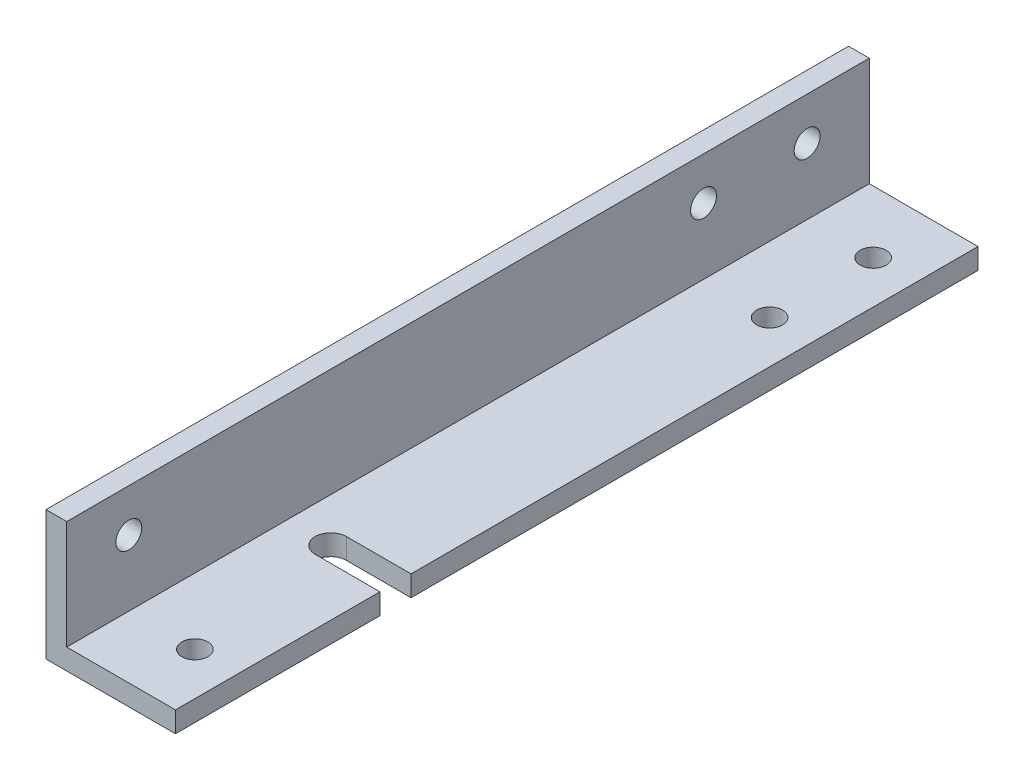
ISO-10303-21;
HEADER;
FILE_DESCRIPTION(('STEP AP214'),'2;1');
FILE_NAME('part.step','',(''),(''),'','','');
FILE_SCHEMA(('AUTOMOTIVE_DESIGN { 1 0 10303 214 1 1 1 1 }'));
ENDSEC;
DATA;
#1=APPLICATION_CONTEXT('core data for automotive mechanical design processes');
#2=APPLICATION_PROTOCOL_DEFINITION('international standard','automotive_design',2000,#1);
#3=PRODUCT_CONTEXT('',#1,'mechanical');
#4=PRODUCT('Part','Part','',(#3));
#5=PRODUCT_RELATED_PRODUCT_CATEGORY('part','',(#4));
#6=PRODUCT_DEFINITION_FORMATION('','',#4);
#7=PRODUCT_DEFINITION_CONTEXT('part definition',#1,'design');
#8=PRODUCT_DEFINITION('design','',#6,#7);
#9=PRODUCT_DEFINITION_SHAPE('','',#8);
#10=(LENGTH_UNIT() NAMED_UNIT(*) SI_UNIT(.MILLI.,.METRE.));
#11=(NAMED_UNIT(*) PLANE_ANGLE_UNIT() SI_UNIT($,.RADIAN.));
#12=(NAMED_UNIT(*) SI_UNIT($,.STERADIAN.) SOLID_ANGLE_UNIT());
#13=UNCERTAINTY_MEASURE_WITH_UNIT(LENGTH_MEASURE(1.E-05),#10,'distance_accuracy_value','');
#14=(GEOMETRIC_REPRESENTATION_CONTEXT(3) GLOBAL_UNCERTAINTY_ASSIGNED_CONTEXT((#13)) GLOBAL_UNIT_ASSIGNED_CONTEXT((#10,
#11,#12)) REPRESENTATION_CONTEXT('',''));
#15=CARTESIAN_POINT('',(0.,0.,0.));
#16=DIRECTION('',(0.,0.,1.));
#17=DIRECTION('',(1.,0.,0.));
#18=AXIS2_PLACEMENT_3D('',#15,#16,#17);
#19=CARTESIAN_POINT('',(25.,0.,155.));
#20=DIRECTION('',(-1.,0.,0.));
#21=DIRECTION('',(0.,0.,1.));
#22=AXIS2_PLACEMENT_3D('',#19,#20,#21);
#23=PLANE('',#22);
#24=DIRECTION('',(0.,0.,-1.));
#25=VECTOR('',#24,1.);
#26=CARTESIAN_POINT('',(25.,4.,155.));
#27=LINE('',#26,#25);
#28=CARTESIAN_POINT('',(25.,4.,109.5));
#29=VERTEX_POINT('',#28);
#30=CARTESIAN_POINT('',(25.,4.,0.));
#31=VERTEX_POINT('',#30);
#32=EDGE_CURVE('E133',#29,#31,#27,.T.);
#33=ORIENTED_EDGE('',*,*,#32,.F.);
#34=DIRECTION('',(0.,-1.,0.));
#35=VECTOR('',#34,1.);
#36=CARTESIAN_POINT('',(25.,25.,109.5));
#37=LINE('',#36,#35);
#38=CARTESIAN_POINT('',(25.,0.,109.5));
#39=VERTEX_POINT('',#38);
#40=EDGE_CURVE('E201',#29,#39,#37,.T.);
#41=ORIENTED_EDGE('',*,*,#40,.T.);
#42=DIRECTION('',(0.,0.,-1.));
#43=VECTOR('',#42,1.);
#44=CARTESIAN_POINT('',(25.,0.,155.));
#45=LINE('',#44,#43);
#46=CARTESIAN_POINT('',(25.,0.,0.));
#47=VERTEX_POINT('',#46);
#48=EDGE_CURVE('E132',#39,#47,#45,.T.);
#49=ORIENTED_EDGE('',*,*,#48,.T.);
#50=DIRECTION('',(0.,1.,0.));
#51=VECTOR('',#50,1.);
#52=CARTESIAN_POINT('',(25.,0.,0.));
#53=LINE('',#52,#51);
#54=EDGE_CURVE('E157',#47,#31,#53,.T.);
#55=ORIENTED_EDGE('',*,*,#54,.T.);
#56=EDGE_LOOP('',(#33,#41,#49,#55));
#57=FACE_BOUND('',#56,.T.);
#58=ADVANCED_FACE('F39',(#57),#23,.F.);
#59=CARTESIAN_POINT('',(4.,25.,155.));
#60=DIRECTION('',(0.,-1.,0.));
#61=DIRECTION('',(0.,0.,-1.));
#62=AXIS2_PLACEMENT_3D('',#59,#60,#61);
#63=PLANE('',#62);
#64=DIRECTION('',(-1.,0.,0.));
#65=VECTOR('',#64,1.);
#66=CARTESIAN_POINT('',(4.,25.,0.));
#67=LINE('',#66,#65);
#68=CARTESIAN_POINT('',(4.,25.,0.));
#69=VERTEX_POINT('',#68);
#70=CARTESIAN_POINT('',(0.,25.,0.));
#71=VERTEX_POINT('',#70);
#72=EDGE_CURVE('E145',#69,#71,#67,.T.);
#73=ORIENTED_EDGE('',*,*,#72,.T.);
#74=DIRECTION('',(0.,0.,-1.));
#75=VECTOR('',#74,1.);
#76=CARTESIAN_POINT('',(0.,25.,155.));
#77=LINE('',#76,#75);
#78=CARTESIAN_POINT('',(0.,25.,155.));
#79=VERTEX_POINT('',#78);
#80=EDGE_CURVE('E178',#79,#71,#77,.T.);
#81=ORIENTED_EDGE('',*,*,#80,.F.);
#82=DIRECTION('',(-1.,0.,0.));
#83=VECTOR('',#82,1.);
#84=CARTESIAN_POINT('',(4.,25.,155.));
#85=LINE('',#84,#83);
#86=CARTESIAN_POINT('',(4.,25.,155.));
#87=VERTEX_POINT('',#86);
#88=EDGE_CURVE('E166',#87,#79,#85,.T.);
#89=ORIENTED_EDGE('',*,*,#88,.F.);
#90=DIRECTION('',(0.,0.,-1.));
#91=VECTOR('',#90,1.);
#92=CARTESIAN_POINT('',(4.,25.,155.));
#93=LINE('',#92,#91);
#94=EDGE_CURVE('E141',#87,#69,#93,.T.);
#95=ORIENTED_EDGE('',*,*,#94,.T.);
#96=EDGE_LOOP('',(#73,#81,#89,#95));
#97=FACE_BOUND('',#96,.T.);
#98=ADVANCED_FACE('F41',(#97),#63,.F.);
#99=CARTESIAN_POINT('',(0.,25.,155.));
#100=DIRECTION('',(1.,0.,0.));
#101=DIRECTION('',(0.,1.,0.));
#102=AXIS2_PLACEMENT_3D('',#99,#100,#101);
#103=PLANE('',#102);
#104=CARTESIAN_POINT('',(0.,16.75,143.));
#105=DIRECTION('',(1.,0.,0.));
#106=DIRECTION('',(0.,0.,-1.));
#107=AXIS2_PLACEMENT_3D('',#104,#105,#106);
#108=CIRCLE('',#107,2.5);
#109=CARTESIAN_POINT('',(0.,16.75,140.5));
#110=VERTEX_POINT('',#109);
#111=EDGE_CURVE('E217',#110,#110,#108,.T.);
#112=ORIENTED_EDGE('',*,*,#111,.T.);
#113=EDGE_LOOP('',(#112));
#114=FACE_BOUND('',#113,.T.);
#115=CARTESIAN_POINT('',(0.,16.75,12.));
#116=DIRECTION('',(1.,0.,0.));
#117=DIRECTION('',(0.,0.,-1.));
#118=AXIS2_PLACEMENT_3D('',#115,#116,#117);
#119=CIRCLE('',#118,2.5);
#120=CARTESIAN_POINT('',(0.,16.75,9.5));
#121=VERTEX_POINT('',#120);
#122=EDGE_CURVE('E225',#121,#121,#119,.T.);
#123=ORIENTED_EDGE('',*,*,#122,.T.);
#124=EDGE_LOOP('',(#123));
#125=FACE_BOUND('',#124,.T.);
#126=CARTESIAN_POINT('',(0.,16.75,32.));
#127=DIRECTION('',(1.,0.,0.));
#128=DIRECTION('',(0.,0.,-1.));
#129=AXIS2_PLACEMENT_3D('',#126,#127,#128);
#130=CIRCLE('',#129,2.5);
#131=CARTESIAN_POINT('',(0.,16.75,29.5));
#132=VERTEX_POINT('',#131);
#133=EDGE_CURVE('E233',#132,#132,#130,.T.);
#134=ORIENTED_EDGE('',*,*,#133,.T.);
#135=EDGE_LOOP('',(#134));
#136=FACE_BOUND('',#135,.T.);
#137=DIRECTION('',(0.,-1.,0.));
#138=VECTOR('',#137,1.);
#139=CARTESIAN_POINT('',(0.,25.,0.));
#140=LINE('',#139,#138);
#141=CARTESIAN_POINT('',(0.,0.,0.));
#142=VERTEX_POINT('',#141);
#143=EDGE_CURVE('E149',#71,#142,#140,.T.);
#144=ORIENTED_EDGE('',*,*,#143,.T.);
#145=DIRECTION('',(0.,0.,-1.));
#146=VECTOR('',#145,1.);
#147=CARTESIAN_POINT('',(0.,0.,155.));
#148=LINE('',#147,#146);
#149=CARTESIAN_POINT('',(0.,0.,155.));
#150=VERTEX_POINT('',#149);
#151=EDGE_CURVE('E174',#150,#142,#148,.T.);
#152=ORIENTED_EDGE('',*,*,#151,.F.);
#153=DIRECTION('',(0.,-1.,0.));
#154=VECTOR('',#153,1.);
#155=CARTESIAN_POINT('',(0.,25.,155.));
#156=LINE('',#155,#154);
#157=EDGE_CURVE('E100',#79,#150,#156,.T.);
#158=ORIENTED_EDGE('',*,*,#157,.F.);
#159=ORIENTED_EDGE('',*,*,#80,.T.);
#160=EDGE_LOOP('',(#144,#152,#158,#159));
#161=FACE_BOUND('',#160,.T.);
#162=ADVANCED_FACE('F266',(#114,#125,#136,#161),#103,.F.);
#163=CARTESIAN_POINT('',(0.,0.,155.));
#164=DIRECTION('',(0.,1.,0.));
#165=DIRECTION('',(0.,0.,1.));
#166=AXIS2_PLACEMENT_3D('',#163,#164,#165);
#167=PLANE('',#166);
#168=CARTESIAN_POINT('',(16.75,0.,12.));
#169=DIRECTION('',(0.,1.,0.));
#170=DIRECTION('',(0.,0.,1.));
#171=AXIS2_PLACEMENT_3D('',#168,#169,#170);
#172=CIRCLE('',#171,2.5);
#173=CARTESIAN_POINT('',(16.75,0.,14.5));
#174=VERTEX_POINT('',#173);
#175=EDGE_CURVE('E241',#174,#174,#172,.T.);
#176=ORIENTED_EDGE('',*,*,#175,.T.);
#177=EDGE_LOOP('',(#176));
#178=FACE_BOUND('',#177,.T.);
#179=CARTESIAN_POINT('',(16.75,0.,143.));
#180=DIRECTION('',(0.,1.,0.));
#181=DIRECTION('',(0.,0.,1.));
#182=AXIS2_PLACEMENT_3D('',#179,#180,#181);
#183=CIRCLE('',#182,2.5);
#184=CARTESIAN_POINT('',(16.75,0.,145.5));
#185=VERTEX_POINT('',#184);
#186=EDGE_CURVE('E249',#185,#185,#183,.T.);
#187=ORIENTED_EDGE('',*,*,#186,.T.);
#188=EDGE_LOOP('',(#187));
#189=FACE_BOUND('',#188,.T.);
#190=CARTESIAN_POINT('',(16.75,0.,32.));
#191=DIRECTION('',(0.,1.,0.));
#192=DIRECTION('',(0.,0.,1.));
#193=AXIS2_PLACEMENT_3D('',#190,#191,#192);
#194=CIRCLE('',#193,2.5);
#195=CARTESIAN_POINT('',(16.75,0.,34.5));
#196=VERTEX_POINT('',#195);
#197=EDGE_CURVE('E150',#196,#196,#194,.T.);
#198=ORIENTED_EDGE('',*,*,#197,.T.);
#199=EDGE_LOOP('',(#198));
#200=FACE_BOUND('',#199,.T.);
#201=ORIENTED_EDGE('',*,*,#48,.F.);
#202=DIRECTION('',(1.,0.,0.));
#203=VECTOR('',#202,1.);
#204=CARTESIAN_POINT('',(25.,0.,109.5));
#205=LINE('',#204,#203);
#206=CARTESIAN_POINT('',(12.5,0.,109.5));
#207=VERTEX_POINT('',#206);
#208=EDGE_CURVE('E213',#207,#39,#205,.T.);
#209=ORIENTED_EDGE('',*,*,#208,.F.);
#210=CARTESIAN_POINT('',(12.5,0.,112.5));
#211=DIRECTION('',(0.,-1.,0.));
#212=DIRECTION('',(0.,0.,-1.));
#213=AXIS2_PLACEMENT_3D('',#210,#211,#212);
#214=CIRCLE('',#213,3.);
#215=CARTESIAN_POINT('',(12.5,0.,115.5));
#216=VERTEX_POINT('',#215);
#217=EDGE_CURVE('E196',#216,#207,#214,.T.);
#218=ORIENTED_EDGE('',*,*,#217,.F.);
#219=DIRECTION('',(-1.,0.,0.));
#220=VECTOR('',#219,1.);
#221=CARTESIAN_POINT('',(25.,0.,115.5));
#222=LINE('',#221,#220);
#223=CARTESIAN_POINT('',(25.,0.,115.5));
#224=VERTEX_POINT('',#223);
#225=EDGE_CURVE('E273',#224,#216,#222,.T.);
#226=ORIENTED_EDGE('',*,*,#225,.F.);
#227=CARTESIAN_POINT('',(25.,0.,155.));
#228=VERTEX_POINT('',#227);
#229=EDGE_CURVE('E171',#228,#224,#45,.T.);
#230=ORIENTED_EDGE('',*,*,#229,.F.);
#231=DIRECTION('',(1.,0.,0.));
#232=VECTOR('',#231,1.);
#233=CARTESIAN_POINT('',(0.,0.,155.));
#234=LINE('',#233,#232);
#235=EDGE_CURVE('E116',#150,#228,#234,.T.);
#236=ORIENTED_EDGE('',*,*,#235,.F.);
#237=ORIENTED_EDGE('',*,*,#151,.T.);
#238=DIRECTION('',(1.,0.,0.));
#239=VECTOR('',#238,1.);
#240=CARTESIAN_POINT('',(0.,0.,0.));
#241=LINE('',#240,#239);
#242=EDGE_CURVE('E153',#142,#47,#241,.T.);
#243=ORIENTED_EDGE('',*,*,#242,.T.);
#244=EDGE_LOOP('',(#201,#209,#218,#226,#230,#236,#237,#243));
#245=FACE_BOUND('',#244,.T.);
#246=ADVANCED_FACE('F270',(#178,#189,#200,#245),#167,.F.);
#247=ORIENTED_EDGE('',*,*,#229,.T.);
#248=DIRECTION('',(0.,-1.,0.));
#249=VECTOR('',#248,1.);
#250=CARTESIAN_POINT('',(25.,25.,115.5));
#251=LINE('',#250,#249);
#252=CARTESIAN_POINT('',(25.,4.,115.5));
#253=VERTEX_POINT('',#252);
#254=EDGE_CURVE('E128',#253,#224,#251,.T.);
#255=ORIENTED_EDGE('',*,*,#254,.F.);
#256=CARTESIAN_POINT('',(25.,4.,155.));
#257=VERTEX_POINT('',#256);
#258=EDGE_CURVE('E124',#257,#253,#27,.T.);
#259=ORIENTED_EDGE('',*,*,#258,.F.);
#260=DIRECTION('',(0.,1.,0.));
#261=VECTOR('',#260,1.);
#262=CARTESIAN_POINT('',(25.,0.,155.));
#263=LINE('',#262,#261);
#264=EDGE_CURVE('E109',#228,#257,#263,.T.);
#265=ORIENTED_EDGE('',*,*,#264,.F.);
#266=EDGE_LOOP('',(#247,#255,#259,#265));
#267=FACE_BOUND('',#266,.T.);
#268=ADVANCED_FACE('F125',(#267),#23,.F.);
#269=CARTESIAN_POINT('',(25.,4.,155.));
#270=DIRECTION('',(0.,-1.,0.));
#271=DIRECTION('',(1.,0.,0.));
#272=AXIS2_PLACEMENT_3D('',#269,#270,#271);
#273=PLANE('',#272);
#274=CARTESIAN_POINT('',(16.75,4.,12.));
#275=DIRECTION('',(0.,1.,0.));
#276=DIRECTION('',(0.,0.,1.));
#277=AXIS2_PLACEMENT_3D('',#274,#275,#276);
#278=CIRCLE('',#277,2.5);
#279=CARTESIAN_POINT('',(16.75,4.,14.5));
#280=VERTEX_POINT('',#279);
#281=EDGE_CURVE('E237',#280,#280,#278,.T.);
#282=ORIENTED_EDGE('',*,*,#281,.F.);
#283=EDGE_LOOP('',(#282));
#284=FACE_BOUND('',#283,.T.);
#285=CARTESIAN_POINT('',(16.75,4.,143.));
#286=DIRECTION('',(0.,1.,0.));
#287=DIRECTION('',(0.,0.,1.));
#288=AXIS2_PLACEMENT_3D('',#285,#286,#287);
#289=CIRCLE('',#288,2.5);
#290=CARTESIAN_POINT('',(16.75,4.,145.5));
#291=VERTEX_POINT('',#290);
#292=EDGE_CURVE('E245',#291,#291,#289,.T.);
#293=ORIENTED_EDGE('',*,*,#292,.F.);
#294=EDGE_LOOP('',(#293));
#295=FACE_BOUND('',#294,.T.);
#296=CARTESIAN_POINT('',(16.75,4.,32.));
#297=DIRECTION('',(0.,1.,0.));
#298=DIRECTION('',(0.,0.,1.));
#299=AXIS2_PLACEMENT_3D('',#296,#297,#298);
#300=CIRCLE('',#299,2.5);
#301=CARTESIAN_POINT('',(16.75,4.,34.5));
#302=VERTEX_POINT('',#301);
#303=EDGE_CURVE('E253',#302,#302,#300,.T.);
#304=ORIENTED_EDGE('',*,*,#303,.F.);
#305=EDGE_LOOP('',(#304));
#306=FACE_BOUND('',#305,.T.);
#307=CARTESIAN_POINT('',(12.5,4.,112.5));
#308=DIRECTION('',(0.,-1.,0.));
#309=DIRECTION('',(1.,0.,0.));
#310=AXIS2_PLACEMENT_3D('',#307,#308,#309);
#311=CIRCLE('',#310,3.);
#312=CARTESIAN_POINT('',(12.5,4.,115.5));
#313=VERTEX_POINT('',#312);
#314=CARTESIAN_POINT('',(12.5,4.,109.5));
#315=VERTEX_POINT('',#314);
#316=EDGE_CURVE('E48',#313,#315,#311,.T.);
#317=ORIENTED_EDGE('',*,*,#316,.T.);
#318=DIRECTION('',(1.,0.,0.));
#319=VECTOR('',#318,1.);
#320=CARTESIAN_POINT('',(25.,4.,109.5));
#321=LINE('',#320,#319);
#322=EDGE_CURVE('E11',#315,#29,#321,.T.);
#323=ORIENTED_EDGE('',*,*,#322,.T.);
#324=ORIENTED_EDGE('',*,*,#32,.T.);
#325=DIRECTION('',(-1.,0.,0.));
#326=VECTOR('',#325,1.);
#327=CARTESIAN_POINT('',(25.,4.,0.));
#328=LINE('',#327,#326);
#329=CARTESIAN_POINT('',(4.,4.,0.));
#330=VERTEX_POINT('',#329);
#331=EDGE_CURVE('E161',#31,#330,#328,.T.);
#332=ORIENTED_EDGE('',*,*,#331,.T.);
#333=DIRECTION('',(0.,0.,-1.));
#334=VECTOR('',#333,1.);
#335=CARTESIAN_POINT('',(4.,4.,155.));
#336=LINE('',#335,#334);
#337=CARTESIAN_POINT('',(4.,4.,155.));
#338=VERTEX_POINT('',#337);
#339=EDGE_CURVE('E137',#338,#330,#336,.T.);
#340=ORIENTED_EDGE('',*,*,#339,.F.);
#341=DIRECTION('',(-1.,0.,0.));
#342=VECTOR('',#341,1.);
#343=CARTESIAN_POINT('',(25.,4.,155.));
#344=LINE('',#343,#342);
#345=EDGE_CURVE('E113',#257,#338,#344,.T.);
#346=ORIENTED_EDGE('',*,*,#345,.F.);
#347=ORIENTED_EDGE('',*,*,#258,.T.);
#348=DIRECTION('',(-1.,0.,0.));
#349=VECTOR('',#348,1.);
#350=CARTESIAN_POINT('',(25.,4.,115.5));
#351=LINE('',#350,#349);
#352=EDGE_CURVE('E181',#253,#313,#351,.T.);
#353=ORIENTED_EDGE('',*,*,#352,.T.);
#354=EDGE_LOOP('',(#317,#323,#324,#332,#340,#346,#347,#353));
#355=FACE_BOUND('',#354,.T.);
#356=ADVANCED_FACE('F136',(#284,#295,#306,#355),#273,.F.);
#357=CARTESIAN_POINT('',(4.,4.,155.));
#358=DIRECTION('',(-1.,0.,0.));
#359=DIRECTION('',(0.,0.,1.));
#360=AXIS2_PLACEMENT_3D('',#357,#358,#359);
#361=PLANE('',#360);
#362=CARTESIAN_POINT('',(4.,16.75,143.));
#363=DIRECTION('',(1.,0.,0.));
#364=DIRECTION('',(0.,0.,-1.));
#365=AXIS2_PLACEMENT_3D('',#362,#363,#364);
#366=CIRCLE('',#365,2.5);
#367=CARTESIAN_POINT('',(4.,16.75,140.5));
#368=VERTEX_POINT('',#367);
#369=EDGE_CURVE('E206',#368,#368,#366,.T.);
#370=ORIENTED_EDGE('',*,*,#369,.F.);
#371=EDGE_LOOP('',(#370));
#372=FACE_BOUND('',#371,.T.);
#373=CARTESIAN_POINT('',(4.,16.75,12.));
#374=DIRECTION('',(1.,0.,0.));
#375=DIRECTION('',(0.,0.,-1.));
#376=AXIS2_PLACEMENT_3D('',#373,#374,#375);
#377=CIRCLE('',#376,2.5);
#378=CARTESIAN_POINT('',(4.,16.75,9.5));
#379=VERTEX_POINT('',#378);
#380=EDGE_CURVE('E221',#379,#379,#377,.T.);
#381=ORIENTED_EDGE('',*,*,#380,.F.);
#382=EDGE_LOOP('',(#381));
#383=FACE_BOUND('',#382,.T.);
#384=CARTESIAN_POINT('',(4.,16.75,32.));
#385=DIRECTION('',(1.,0.,0.));
#386=DIRECTION('',(0.,0.,-1.));
#387=AXIS2_PLACEMENT_3D('',#384,#385,#386);
#388=CIRCLE('',#387,2.5);
#389=CARTESIAN_POINT('',(4.,16.75,29.5));
#390=VERTEX_POINT('',#389);
#391=EDGE_CURVE('E229',#390,#390,#388,.T.);
#392=ORIENTED_EDGE('',*,*,#391,.F.);
#393=EDGE_LOOP('',(#392));
#394=FACE_BOUND('',#393,.T.);
#395=DIRECTION('',(0.,1.,0.));
#396=VECTOR('',#395,1.);
#397=CARTESIAN_POINT('',(4.,4.,0.));
#398=LINE('',#397,#396);
#399=EDGE_CURVE('E91',#330,#69,#398,.T.);
#400=ORIENTED_EDGE('',*,*,#399,.T.);
#401=ORIENTED_EDGE('',*,*,#94,.F.);
#402=DIRECTION('',(0.,1.,0.));
#403=VECTOR('',#402,1.);
#404=CARTESIAN_POINT('',(4.,4.,155.));
#405=LINE('',#404,#403);
#406=EDGE_CURVE('E64',#338,#87,#405,.T.);
#407=ORIENTED_EDGE('',*,*,#406,.F.);
#408=ORIENTED_EDGE('',*,*,#339,.T.);
#409=EDGE_LOOP('',(#400,#401,#407,#408));
#410=FACE_BOUND('',#409,.T.);
#411=ADVANCED_FACE('F303',(#372,#383,#394,#410),#361,.F.);
#412=CARTESIAN_POINT('',(0.,0.,155.));
#413=DIRECTION('',(0.,0.,1.));
#414=DIRECTION('',(1.,0.,0.));
#415=AXIS2_PLACEMENT_3D('',#412,#413,#414);
#416=PLANE('',#415);
#417=ORIENTED_EDGE('',*,*,#88,.T.);
#418=ORIENTED_EDGE('',*,*,#157,.T.);
#419=ORIENTED_EDGE('',*,*,#235,.T.);
#420=ORIENTED_EDGE('',*,*,#264,.T.);
#421=ORIENTED_EDGE('',*,*,#345,.T.);
#422=ORIENTED_EDGE('',*,*,#406,.T.);
#423=EDGE_LOOP('',(#417,#418,#419,#420,#421,#422));
#424=FACE_BOUND('',#423,.T.);
#425=ADVANCED_FACE('F111',(#424),#416,.T.);
#426=CARTESIAN_POINT('',(0.,0.,0.));
#427=DIRECTION('',(0.,0.,1.));
#428=DIRECTION('',(1.,0.,0.));
#429=AXIS2_PLACEMENT_3D('',#426,#427,#428);
#430=PLANE('',#429);
#431=ORIENTED_EDGE('',*,*,#72,.F.);
#432=ORIENTED_EDGE('',*,*,#399,.F.);
#433=ORIENTED_EDGE('',*,*,#331,.F.);
#434=ORIENTED_EDGE('',*,*,#54,.F.);
#435=ORIENTED_EDGE('',*,*,#242,.F.);
#436=ORIENTED_EDGE('',*,*,#143,.F.);
#437=EDGE_LOOP('',(#431,#432,#433,#434,#435,#436));
#438=FACE_BOUND('',#437,.T.);
#439=ADVANCED_FACE('F320',(#438),#430,.F.);
#440=CARTESIAN_POINT('',(16.75,4.,32.));
#441=DIRECTION('',(0.,1.,0.));
#442=DIRECTION('',(0.,0.,1.));
#443=AXIS2_PLACEMENT_3D('',#440,#441,#442);
#444=CYLINDRICAL_SURFACE('',#443,2.5);
#445=ORIENTED_EDGE('',*,*,#197,.F.);
#446=EDGE_LOOP('',(#445));
#447=FACE_BOUND('',#446,.T.);
#448=ORIENTED_EDGE('',*,*,#303,.T.);
#449=EDGE_LOOP('',(#448));
#450=FACE_BOUND('',#449,.T.);
#451=ADVANCED_FACE('F316',(#447,#450),#444,.F.);
#452=CARTESIAN_POINT('',(16.75,4.,143.));
#453=DIRECTION('',(0.,1.,0.));
#454=DIRECTION('',(0.,0.,1.));
#455=AXIS2_PLACEMENT_3D('',#452,#453,#454);
#456=CYLINDRICAL_SURFACE('',#455,2.5);
#457=ORIENTED_EDGE('',*,*,#186,.F.);
#458=EDGE_LOOP('',(#457));
#459=FACE_BOUND('',#458,.T.);
#460=ORIENTED_EDGE('',*,*,#292,.T.);
#461=EDGE_LOOP('',(#460));
#462=FACE_BOUND('',#461,.T.);
#463=ADVANCED_FACE('F319',(#459,#462),#456,.F.);
#464=CARTESIAN_POINT('',(16.75,4.,12.));
#465=DIRECTION('',(0.,1.,0.));
#466=DIRECTION('',(0.,0.,1.));
#467=AXIS2_PLACEMENT_3D('',#464,#465,#466);
#468=CYLINDRICAL_SURFACE('',#467,2.5);
#469=ORIENTED_EDGE('',*,*,#175,.F.);
#470=EDGE_LOOP('',(#469));
#471=FACE_BOUND('',#470,.T.);
#472=ORIENTED_EDGE('',*,*,#281,.T.);
#473=EDGE_LOOP('',(#472));
#474=FACE_BOUND('',#473,.T.);
#475=ADVANCED_FACE('F328',(#471,#474),#468,.F.);
#476=CARTESIAN_POINT('',(4.,16.75,32.));
#477=DIRECTION('',(1.,0.,0.));
#478=DIRECTION('',(0.,0.,-1.));
#479=AXIS2_PLACEMENT_3D('',#476,#477,#478);
#480=CYLINDRICAL_SURFACE('',#479,2.5);
#481=ORIENTED_EDGE('',*,*,#133,.F.);
#482=EDGE_LOOP('',(#481));
#483=FACE_BOUND('',#482,.T.);
#484=ORIENTED_EDGE('',*,*,#391,.T.);
#485=EDGE_LOOP('',(#484));
#486=FACE_BOUND('',#485,.T.);
#487=ADVANCED_FACE('F347',(#483,#486),#480,.F.);
#488=CARTESIAN_POINT('',(4.,16.75,12.));
#489=DIRECTION('',(1.,0.,0.));
#490=DIRECTION('',(0.,0.,-1.));
#491=AXIS2_PLACEMENT_3D('',#488,#489,#490);
#492=CYLINDRICAL_SURFACE('',#491,2.5);
#493=ORIENTED_EDGE('',*,*,#122,.F.);
#494=EDGE_LOOP('',(#493));
#495=FACE_BOUND('',#494,.T.);
#496=ORIENTED_EDGE('',*,*,#380,.T.);
#497=EDGE_LOOP('',(#496));
#498=FACE_BOUND('',#497,.T.);
#499=ADVANCED_FACE('F349',(#495,#498),#492,.F.);
#500=CARTESIAN_POINT('',(4.,16.75,143.));
#501=DIRECTION('',(1.,0.,0.));
#502=DIRECTION('',(0.,0.,-1.));
#503=AXIS2_PLACEMENT_3D('',#500,#501,#502);
#504=CYLINDRICAL_SURFACE('',#503,2.5);
#505=ORIENTED_EDGE('',*,*,#111,.F.);
#506=EDGE_LOOP('',(#505));
#507=FACE_BOUND('',#506,.T.);
#508=ORIENTED_EDGE('',*,*,#369,.T.);
#509=EDGE_LOOP('',(#508));
#510=FACE_BOUND('',#509,.T.);
#511=ADVANCED_FACE('F356',(#507,#510),#504,.F.);
#512=CARTESIAN_POINT('',(25.,25.,109.5));
#513=DIRECTION('',(0.,0.,-1.));
#514=DIRECTION('',(-1.,0.,0.));
#515=AXIS2_PLACEMENT_3D('',#512,#513,#514);
#516=PLANE('',#515);
#517=DIRECTION('',(0.,-1.,0.));
#518=VECTOR('',#517,1.);
#519=CARTESIAN_POINT('',(12.5,25.,109.5));
#520=LINE('',#519,#518);
#521=EDGE_CURVE('E193',#315,#207,#520,.T.);
#522=ORIENTED_EDGE('',*,*,#521,.T.);
#523=ORIENTED_EDGE('',*,*,#208,.T.);
#524=ORIENTED_EDGE('',*,*,#40,.F.);
#525=ORIENTED_EDGE('',*,*,#322,.F.);
#526=EDGE_LOOP('',(#522,#523,#524,#525));
#527=FACE_BOUND('',#526,.T.);
#528=ADVANCED_FACE('F286',(#527),#516,.F.);
#529=CARTESIAN_POINT('',(12.5,25.,112.5));
#530=DIRECTION('',(0.,-1.,0.));
#531=DIRECTION('',(0.,0.,-1.));
#532=AXIS2_PLACEMENT_3D('',#529,#530,#531);
#533=CYLINDRICAL_SURFACE('',#532,3.);
#534=DIRECTION('',(0.,-1.,0.));
#535=VECTOR('',#534,1.);
#536=CARTESIAN_POINT('',(12.5,25.,115.5));
#537=LINE('',#536,#535);
#538=EDGE_CURVE('E55',#313,#216,#537,.T.);
#539=ORIENTED_EDGE('',*,*,#538,.T.);
#540=ORIENTED_EDGE('',*,*,#217,.T.);
#541=ORIENTED_EDGE('',*,*,#521,.F.);
#542=ORIENTED_EDGE('',*,*,#316,.F.);
#543=EDGE_LOOP('',(#539,#540,#541,#542));
#544=FACE_BOUND('',#543,.T.);
#545=ADVANCED_FACE('F189',(#544),#533,.F.);
#546=CARTESIAN_POINT('',(25.,25.,115.5));
#547=DIRECTION('',(0.,0.,1.));
#548=DIRECTION('',(1.,0.,0.));
#549=AXIS2_PLACEMENT_3D('',#546,#547,#548);
#550=PLANE('',#549);
#551=ORIENTED_EDGE('',*,*,#254,.T.);
#552=ORIENTED_EDGE('',*,*,#225,.T.);
#553=ORIENTED_EDGE('',*,*,#538,.F.);
#554=ORIENTED_EDGE('',*,*,#352,.F.);
#555=EDGE_LOOP('',(#551,#552,#553,#554));
#556=FACE_BOUND('',#555,.T.);
#557=ADVANCED_FACE('F280',(#556),#550,.F.);
#558=CLOSED_SHELL('',(#58,#98,#162,#246,#268,#356,#411,#425,#439,#451,#463,#475,#487,#499,#511,
#528,#545,#557));
#559=MANIFOLD_SOLID_BREP('B2',#558);
#560=ADVANCED_BREP_SHAPE_REPRESENTATION('',(#18,#559),#14);
#561=SHAPE_DEFINITION_REPRESENTATION(#9,#560);
ENDSEC;
END-ISO-10303-21;
